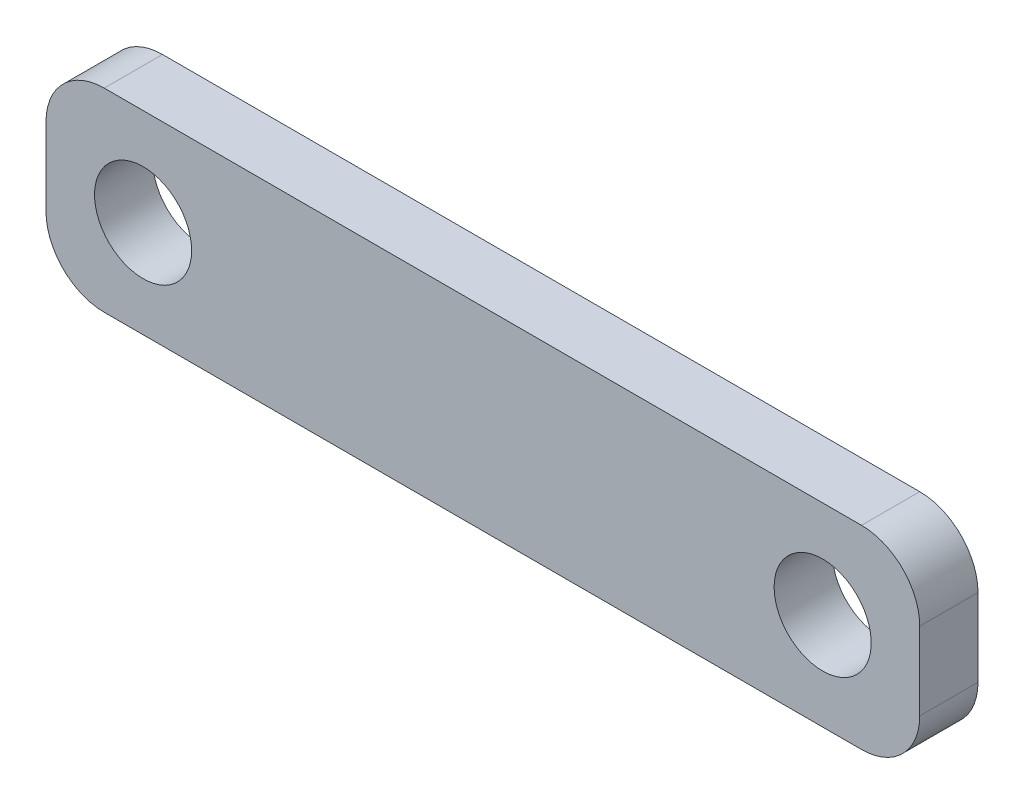
ISO-10303-21;
HEADER;
FILE_DESCRIPTION(('STEP AP214'),'2;1');
FILE_NAME('part.step','',(''),(''),'','','');
FILE_SCHEMA(('AUTOMOTIVE_DESIGN { 1 0 10303 214 1 1 1 1 }'));
ENDSEC;
DATA;
#1=APPLICATION_CONTEXT('core data for automotive mechanical design processes');
#2=APPLICATION_PROTOCOL_DEFINITION('international standard','automotive_design',2000,#1);
#3=PRODUCT_CONTEXT('',#1,'mechanical');
#4=PRODUCT('Part','Part','',(#3));
#5=PRODUCT_RELATED_PRODUCT_CATEGORY('part','',(#4));
#6=PRODUCT_DEFINITION_FORMATION('','',#4);
#7=PRODUCT_DEFINITION_CONTEXT('part definition',#1,'design');
#8=PRODUCT_DEFINITION('design','',#6,#7);
#9=PRODUCT_DEFINITION_SHAPE('','',#8);
#10=(LENGTH_UNIT() NAMED_UNIT(*) SI_UNIT(.MILLI.,.METRE.));
#11=(NAMED_UNIT(*) PLANE_ANGLE_UNIT() SI_UNIT($,.RADIAN.));
#12=(NAMED_UNIT(*) SI_UNIT($,.STERADIAN.) SOLID_ANGLE_UNIT());
#13=UNCERTAINTY_MEASURE_WITH_UNIT(LENGTH_MEASURE(1.E-05),#10,'distance_accuracy_value','');
#14=(GEOMETRIC_REPRESENTATION_CONTEXT(3) GLOBAL_UNCERTAINTY_ASSIGNED_CONTEXT((#13)) GLOBAL_UNIT_ASSIGNED_CONTEXT((#10,
#11,#12)) REPRESENTATION_CONTEXT('',''));
#15=CARTESIAN_POINT('',(0.,0.,0.));
#16=DIRECTION('',(0.,0.,1.));
#17=DIRECTION('',(1.,0.,0.));
#18=AXIS2_PLACEMENT_3D('',#15,#16,#17);
#19=CARTESIAN_POINT('',(19.5,-2.,3.));
#20=DIRECTION('',(0.,0.,1.));
#21=DIRECTION('',(1.,0.,0.));
#22=AXIS2_PLACEMENT_3D('',#19,#20,#21);
#23=PLANE('',#22);
#24=CARTESIAN_POINT('',(-17.5,0.,3.));
#25=DIRECTION('',(0.,0.,1.));
#26=DIRECTION('',(1.,0.,0.));
#27=AXIS2_PLACEMENT_3D('',#24,#25,#26);
#28=CIRCLE('',#27,2.5);
#29=CARTESIAN_POINT('',(-15.,0.,3.));
#30=VERTEX_POINT('',#29);
#31=EDGE_CURVE('E140',#30,#30,#28,.T.);
#32=ORIENTED_EDGE('',*,*,#31,.F.);
#33=EDGE_LOOP('',(#32));
#34=FACE_BOUND('',#33,.T.);
#35=CARTESIAN_POINT('',(19.5,-2.,3.));
#36=DIRECTION('',(0.,0.,1.));
#37=DIRECTION('',(1.,0.,0.));
#38=AXIS2_PLACEMENT_3D('',#35,#36,#37);
#39=CIRCLE('',#38,3.);
#40=CARTESIAN_POINT('',(19.5,-5.,3.));
#41=VERTEX_POINT('',#40);
#42=CARTESIAN_POINT('',(22.5,-1.99999999999998,3.));
#43=VERTEX_POINT('',#42);
#44=EDGE_CURVE('E151',#41,#43,#39,.T.);
#45=ORIENTED_EDGE('',*,*,#44,.T.);
#46=DIRECTION('',(0.,1.,0.));
#47=VECTOR('',#46,1.);
#48=CARTESIAN_POINT('',(22.5,-1.99999999999998,3.));
#49=LINE('',#48,#47);
#50=CARTESIAN_POINT('',(22.5,1.99999999999998,3.));
#51=VERTEX_POINT('',#50);
#52=EDGE_CURVE('E99',#43,#51,#49,.T.);
#53=ORIENTED_EDGE('',*,*,#52,.T.);
#54=CARTESIAN_POINT('',(19.5,2.,3.));
#55=DIRECTION('',(0.,0.,1.));
#56=DIRECTION('',(-1.,0.,0.));
#57=AXIS2_PLACEMENT_3D('',#54,#55,#56);
#58=CIRCLE('',#57,3.);
#59=CARTESIAN_POINT('',(19.5,5.,3.));
#60=VERTEX_POINT('',#59);
#61=EDGE_CURVE('E166',#51,#60,#58,.T.);
#62=ORIENTED_EDGE('',*,*,#61,.T.);
#63=DIRECTION('',(-1.,0.,0.));
#64=VECTOR('',#63,1.);
#65=CARTESIAN_POINT('',(-19.5,5.,3.));
#66=LINE('',#65,#64);
#67=CARTESIAN_POINT('',(-19.5,5.,3.));
#68=VERTEX_POINT('',#67);
#69=EDGE_CURVE('E179',#60,#68,#66,.T.);
#70=ORIENTED_EDGE('',*,*,#69,.T.);
#71=CARTESIAN_POINT('',(-19.5,2.,3.));
#72=DIRECTION('',(0.,0.,1.));
#73=DIRECTION('',(-1.,0.,0.));
#74=AXIS2_PLACEMENT_3D('',#71,#72,#73);
#75=CIRCLE('',#74,3.);
#76=CARTESIAN_POINT('',(-22.5,1.99999999999998,3.));
#77=VERTEX_POINT('',#76);
#78=EDGE_CURVE('E118',#68,#77,#75,.T.);
#79=ORIENTED_EDGE('',*,*,#78,.T.);
#80=DIRECTION('',(0.,-1.,0.));
#81=VECTOR('',#80,1.);
#82=CARTESIAN_POINT('',(-22.5,-1.99999999999998,3.));
#83=LINE('',#82,#81);
#84=CARTESIAN_POINT('',(-22.5,-2.,3.));
#85=VERTEX_POINT('',#84);
#86=EDGE_CURVE('E112',#77,#85,#83,.T.);
#87=ORIENTED_EDGE('',*,*,#86,.T.);
#88=CARTESIAN_POINT('',(-19.5,-2.,3.));
#89=DIRECTION('',(0.,0.,1.));
#90=DIRECTION('',(-1.,0.,0.));
#91=AXIS2_PLACEMENT_3D('',#88,#89,#90);
#92=CIRCLE('',#91,3.);
#93=CARTESIAN_POINT('',(-19.5,-5.,3.));
#94=VERTEX_POINT('',#93);
#95=EDGE_CURVE('E116',#85,#94,#92,.T.);
#96=ORIENTED_EDGE('',*,*,#95,.T.);
#97=DIRECTION('',(1.,0.,0.));
#98=VECTOR('',#97,1.);
#99=CARTESIAN_POINT('',(-19.5,-5.,3.));
#100=LINE('',#99,#98);
#101=EDGE_CURVE('E56',#94,#41,#100,.T.);
#102=ORIENTED_EDGE('',*,*,#101,.T.);
#103=EDGE_LOOP('',(#45,#53,#62,#70,#79,#87,#96,#102));
#104=FACE_BOUND('',#103,.T.);
#105=CARTESIAN_POINT('',(17.5,0.,3.));
#106=DIRECTION('',(0.,0.,1.));
#107=DIRECTION('',(-1.,0.,0.));
#108=AXIS2_PLACEMENT_3D('',#105,#106,#107);
#109=CIRCLE('',#108,2.5);
#110=CARTESIAN_POINT('',(15.,0.,3.));
#111=VERTEX_POINT('',#110);
#112=EDGE_CURVE('E188',#111,#111,#109,.T.);
#113=ORIENTED_EDGE('',*,*,#112,.F.);
#114=EDGE_LOOP('',(#113));
#115=FACE_BOUND('',#114,.T.);
#116=ADVANCED_FACE('F39',(#34,#104,#115),#23,.T.);
#117=CARTESIAN_POINT('',(19.5,-2.,0.));
#118=DIRECTION('',(0.,0.,1.));
#119=DIRECTION('',(1.,0.,0.));
#120=AXIS2_PLACEMENT_3D('',#117,#118,#119);
#121=PLANE('',#120);
#122=CARTESIAN_POINT('',(19.5,-2.,0.));
#123=DIRECTION('',(0.,0.,1.));
#124=DIRECTION('',(1.,0.,0.));
#125=AXIS2_PLACEMENT_3D('',#122,#123,#124);
#126=CIRCLE('',#125,3.);
#127=CARTESIAN_POINT('',(19.5,-5.,0.));
#128=VERTEX_POINT('',#127);
#129=CARTESIAN_POINT('',(22.5,-1.99999999999998,0.));
#130=VERTEX_POINT('',#129);
#131=EDGE_CURVE('E136',#128,#130,#126,.T.);
#132=ORIENTED_EDGE('',*,*,#131,.F.);
#133=DIRECTION('',(1.,0.,0.));
#134=VECTOR('',#133,1.);
#135=CARTESIAN_POINT('',(-19.5,-5.,0.));
#136=LINE('',#135,#134);
#137=CARTESIAN_POINT('',(-19.5,-5.,0.));
#138=VERTEX_POINT('',#137);
#139=EDGE_CURVE('E91',#138,#128,#136,.T.);
#140=ORIENTED_EDGE('',*,*,#139,.F.);
#141=CARTESIAN_POINT('',(-19.5,-2.,0.));
#142=DIRECTION('',(0.,0.,1.));
#143=DIRECTION('',(-1.,0.,0.));
#144=AXIS2_PLACEMENT_3D('',#141,#142,#143);
#145=CIRCLE('',#144,3.);
#146=CARTESIAN_POINT('',(-22.5,-2.,0.));
#147=VERTEX_POINT('',#146);
#148=EDGE_CURVE('E85',#147,#138,#145,.T.);
#149=ORIENTED_EDGE('',*,*,#148,.F.);
#150=DIRECTION('',(0.,-1.,0.));
#151=VECTOR('',#150,1.);
#152=CARTESIAN_POINT('',(-22.5,-1.99999999999998,0.));
#153=LINE('',#152,#151);
#154=CARTESIAN_POINT('',(-22.5,1.99999999999998,0.));
#155=VERTEX_POINT('',#154);
#156=EDGE_CURVE('E126',#155,#147,#153,.T.);
#157=ORIENTED_EDGE('',*,*,#156,.F.);
#158=CARTESIAN_POINT('',(-19.5,2.,0.));
#159=DIRECTION('',(0.,0.,1.));
#160=DIRECTION('',(-1.,0.,0.));
#161=AXIS2_PLACEMENT_3D('',#158,#159,#160);
#162=CIRCLE('',#161,3.);
#163=CARTESIAN_POINT('',(-19.5,5.,0.));
#164=VERTEX_POINT('',#163);
#165=EDGE_CURVE('E146',#164,#155,#162,.T.);
#166=ORIENTED_EDGE('',*,*,#165,.F.);
#167=DIRECTION('',(-1.,0.,0.));
#168=VECTOR('',#167,1.);
#169=CARTESIAN_POINT('',(-19.5,5.,0.));
#170=LINE('',#169,#168);
#171=CARTESIAN_POINT('',(19.5,5.,0.));
#172=VERTEX_POINT('',#171);
#173=EDGE_CURVE('E144',#172,#164,#170,.T.);
#174=ORIENTED_EDGE('',*,*,#173,.F.);
#175=CARTESIAN_POINT('',(19.5,2.,0.));
#176=DIRECTION('',(0.,0.,1.));
#177=DIRECTION('',(-1.,0.,0.));
#178=AXIS2_PLACEMENT_3D('',#175,#176,#177);
#179=CIRCLE('',#178,3.);
#180=CARTESIAN_POINT('',(22.5,1.99999999999998,0.));
#181=VERTEX_POINT('',#180);
#182=EDGE_CURVE('E142',#181,#172,#179,.T.);
#183=ORIENTED_EDGE('',*,*,#182,.F.);
#184=DIRECTION('',(0.,1.,0.));
#185=VECTOR('',#184,1.);
#186=CARTESIAN_POINT('',(22.5,-1.99999999999998,0.));
#187=LINE('',#186,#185);
#188=EDGE_CURVE('E139',#130,#181,#187,.T.);
#189=ORIENTED_EDGE('',*,*,#188,.F.);
#190=EDGE_LOOP('',(#132,#140,#149,#157,#166,#174,#183,#189));
#191=FACE_BOUND('',#190,.T.);
#192=CARTESIAN_POINT('',(-17.5,0.,0.));
#193=DIRECTION('',(0.,0.,1.));
#194=DIRECTION('',(1.,0.,0.));
#195=AXIS2_PLACEMENT_3D('',#192,#193,#194);
#196=CIRCLE('',#195,2.5);
#197=CARTESIAN_POINT('',(-15.,0.,0.));
#198=VERTEX_POINT('',#197);
#199=EDGE_CURVE('E185',#198,#198,#196,.T.);
#200=ORIENTED_EDGE('',*,*,#199,.T.);
#201=EDGE_LOOP('',(#200));
#202=FACE_BOUND('',#201,.T.);
#203=CARTESIAN_POINT('',(17.5,0.,0.));
#204=DIRECTION('',(0.,0.,1.));
#205=DIRECTION('',(-1.,0.,0.));
#206=AXIS2_PLACEMENT_3D('',#203,#204,#205);
#207=CIRCLE('',#206,2.5);
#208=CARTESIAN_POINT('',(15.,0.,0.));
#209=VERTEX_POINT('',#208);
#210=EDGE_CURVE('E191',#209,#209,#207,.T.);
#211=ORIENTED_EDGE('',*,*,#210,.T.);
#212=EDGE_LOOP('',(#211));
#213=FACE_BOUND('',#212,.T.);
#214=ADVANCED_FACE('F170',(#191,#202,#213),#121,.F.);
#215=CARTESIAN_POINT('',(19.5,-2.,3.));
#216=DIRECTION('',(0.,0.,-1.));
#217=DIRECTION('',(-1.,0.,0.));
#218=AXIS2_PLACEMENT_3D('',#215,#216,#217);
#219=CYLINDRICAL_SURFACE('',#218,3.);
#220=ORIENTED_EDGE('',*,*,#131,.T.);
#221=DIRECTION('',(0.,0.,-1.));
#222=VECTOR('',#221,1.);
#223=CARTESIAN_POINT('',(22.5,-1.99999999999998,3.));
#224=LINE('',#223,#222);
#225=EDGE_CURVE('E11',#43,#130,#224,.T.);
#226=ORIENTED_EDGE('',*,*,#225,.F.);
#227=ORIENTED_EDGE('',*,*,#44,.F.);
#228=DIRECTION('',(0.,0.,-1.));
#229=VECTOR('',#228,1.);
#230=CARTESIAN_POINT('',(19.5,-5.,3.));
#231=LINE('',#230,#229);
#232=EDGE_CURVE('E132',#41,#128,#231,.T.);
#233=ORIENTED_EDGE('',*,*,#232,.T.);
#234=EDGE_LOOP('',(#220,#226,#227,#233));
#235=FACE_BOUND('',#234,.T.);
#236=ADVANCED_FACE('F41',(#235),#219,.T.);
#237=CARTESIAN_POINT('',(22.5,-1.99999999999998,3.));
#238=DIRECTION('',(-1.,0.,0.));
#239=DIRECTION('',(0.,0.,1.));
#240=AXIS2_PLACEMENT_3D('',#237,#238,#239);
#241=PLANE('',#240);
#242=ORIENTED_EDGE('',*,*,#188,.T.);
#243=DIRECTION('',(0.,0.,-1.));
#244=VECTOR('',#243,1.);
#245=CARTESIAN_POINT('',(22.5,1.99999999999998,3.));
#246=LINE('',#245,#244);
#247=EDGE_CURVE('E48',#51,#181,#246,.T.);
#248=ORIENTED_EDGE('',*,*,#247,.F.);
#249=ORIENTED_EDGE('',*,*,#52,.F.);
#250=ORIENTED_EDGE('',*,*,#225,.T.);
#251=EDGE_LOOP('',(#242,#248,#249,#250));
#252=FACE_BOUND('',#251,.T.);
#253=ADVANCED_FACE('F223',(#252),#241,.F.);
#254=CARTESIAN_POINT('',(19.5,2.,3.));
#255=DIRECTION('',(0.,0.,-1.));
#256=DIRECTION('',(-1.,0.,0.));
#257=AXIS2_PLACEMENT_3D('',#254,#255,#256);
#258=CYLINDRICAL_SURFACE('',#257,3.);
#259=ORIENTED_EDGE('',*,*,#182,.T.);
#260=DIRECTION('',(0.,0.,-1.));
#261=VECTOR('',#260,1.);
#262=CARTESIAN_POINT('',(19.5,5.,3.));
#263=LINE('',#262,#261);
#264=EDGE_CURVE('E158',#60,#172,#263,.T.);
#265=ORIENTED_EDGE('',*,*,#264,.F.);
#266=ORIENTED_EDGE('',*,*,#61,.F.);
#267=ORIENTED_EDGE('',*,*,#247,.T.);
#268=EDGE_LOOP('',(#259,#265,#266,#267));
#269=FACE_BOUND('',#268,.T.);
#270=ADVANCED_FACE('F164',(#269),#258,.T.);
#271=CARTESIAN_POINT('',(-19.5,5.,3.));
#272=DIRECTION('',(0.,-1.,0.));
#273=DIRECTION('',(0.,0.,-1.));
#274=AXIS2_PLACEMENT_3D('',#271,#272,#273);
#275=PLANE('',#274);
#276=ORIENTED_EDGE('',*,*,#173,.T.);
#277=DIRECTION('',(0.,0.,-1.));
#278=VECTOR('',#277,1.);
#279=CARTESIAN_POINT('',(-19.5,5.,3.));
#280=LINE('',#279,#278);
#281=EDGE_CURVE('E155',#68,#164,#280,.T.);
#282=ORIENTED_EDGE('',*,*,#281,.F.);
#283=ORIENTED_EDGE('',*,*,#69,.F.);
#284=ORIENTED_EDGE('',*,*,#264,.T.);
#285=EDGE_LOOP('',(#276,#282,#283,#284));
#286=FACE_BOUND('',#285,.T.);
#287=ADVANCED_FACE('F175',(#286),#275,.F.);
#288=CARTESIAN_POINT('',(-19.5,2.,3.));
#289=DIRECTION('',(0.,0.,-1.));
#290=DIRECTION('',(-1.,0.,0.));
#291=AXIS2_PLACEMENT_3D('',#288,#289,#290);
#292=CYLINDRICAL_SURFACE('',#291,3.);
#293=ORIENTED_EDGE('',*,*,#165,.T.);
#294=DIRECTION('',(0.,0.,-1.));
#295=VECTOR('',#294,1.);
#296=CARTESIAN_POINT('',(-22.5,1.99999999999998,3.));
#297=LINE('',#296,#295);
#298=EDGE_CURVE('E127',#77,#155,#297,.T.);
#299=ORIENTED_EDGE('',*,*,#298,.F.);
#300=ORIENTED_EDGE('',*,*,#78,.F.);
#301=ORIENTED_EDGE('',*,*,#281,.T.);
#302=EDGE_LOOP('',(#293,#299,#300,#301));
#303=FACE_BOUND('',#302,.T.);
#304=ADVANCED_FACE('F178',(#303),#292,.T.);
#305=CARTESIAN_POINT('',(-22.5,-1.99999999999998,3.));
#306=DIRECTION('',(1.,0.,0.));
#307=DIRECTION('',(0.,0.,-1.));
#308=AXIS2_PLACEMENT_3D('',#305,#306,#307);
#309=PLANE('',#308);
#310=ORIENTED_EDGE('',*,*,#156,.T.);
#311=DIRECTION('',(0.,0.,-1.));
#312=VECTOR('',#311,1.);
#313=CARTESIAN_POINT('',(-22.5,-2.,3.));
#314=LINE('',#313,#312);
#315=EDGE_CURVE('E123',#85,#147,#314,.T.);
#316=ORIENTED_EDGE('',*,*,#315,.F.);
#317=ORIENTED_EDGE('',*,*,#86,.F.);
#318=ORIENTED_EDGE('',*,*,#298,.T.);
#319=EDGE_LOOP('',(#310,#316,#317,#318));
#320=FACE_BOUND('',#319,.T.);
#321=ADVANCED_FACE('F124',(#320),#309,.F.);
#322=CARTESIAN_POINT('',(-19.5,-2.,3.));
#323=DIRECTION('',(0.,0.,-1.));
#324=DIRECTION('',(-1.,0.,0.));
#325=AXIS2_PLACEMENT_3D('',#322,#323,#324);
#326=CYLINDRICAL_SURFACE('',#325,3.);
#327=ORIENTED_EDGE('',*,*,#148,.T.);
#328=DIRECTION('',(0.,0.,-1.));
#329=VECTOR('',#328,1.);
#330=CARTESIAN_POINT('',(-19.5,-5.,3.));
#331=LINE('',#330,#329);
#332=EDGE_CURVE('E128',#94,#138,#331,.T.);
#333=ORIENTED_EDGE('',*,*,#332,.F.);
#334=ORIENTED_EDGE('',*,*,#95,.F.);
#335=ORIENTED_EDGE('',*,*,#315,.T.);
#336=EDGE_LOOP('',(#327,#333,#334,#335));
#337=FACE_BOUND('',#336,.T.);
#338=ADVANCED_FACE('F130',(#337),#326,.T.);
#339=CARTESIAN_POINT('',(-19.5,-5.,3.));
#340=DIRECTION('',(0.,1.,0.));
#341=DIRECTION('',(0.,0.,1.));
#342=AXIS2_PLACEMENT_3D('',#339,#340,#341);
#343=PLANE('',#342);
#344=ORIENTED_EDGE('',*,*,#139,.T.);
#345=ORIENTED_EDGE('',*,*,#232,.F.);
#346=ORIENTED_EDGE('',*,*,#101,.F.);
#347=ORIENTED_EDGE('',*,*,#332,.T.);
#348=EDGE_LOOP('',(#344,#345,#346,#347));
#349=FACE_BOUND('',#348,.T.);
#350=ADVANCED_FACE('F211',(#349),#343,.F.);
#351=CARTESIAN_POINT('',(-17.5,0.,3.));
#352=DIRECTION('',(0.,0.,-1.));
#353=DIRECTION('',(-1.,0.,0.));
#354=AXIS2_PLACEMENT_3D('',#351,#352,#353);
#355=CYLINDRICAL_SURFACE('',#354,2.5);
#356=ORIENTED_EDGE('',*,*,#31,.T.);
#357=EDGE_LOOP('',(#356));
#358=FACE_BOUND('',#357,.T.);
#359=ORIENTED_EDGE('',*,*,#199,.F.);
#360=EDGE_LOOP('',(#359));
#361=FACE_BOUND('',#360,.T.);
#362=ADVANCED_FACE('F208',(#358,#361),#355,.F.);
#363=CARTESIAN_POINT('',(17.5,0.,3.));
#364=DIRECTION('',(0.,0.,-1.));
#365=DIRECTION('',(-1.,0.,0.));
#366=AXIS2_PLACEMENT_3D('',#363,#364,#365);
#367=CYLINDRICAL_SURFACE('',#366,2.5);
#368=ORIENTED_EDGE('',*,*,#112,.T.);
#369=EDGE_LOOP('',(#368));
#370=FACE_BOUND('',#369,.T.);
#371=ORIENTED_EDGE('',*,*,#210,.F.);
#372=EDGE_LOOP('',(#371));
#373=FACE_BOUND('',#372,.T.);
#374=ADVANCED_FACE('F197',(#370,#373),#367,.F.);
#375=CLOSED_SHELL('',(#116,#214,#236,#253,#270,#287,#304,#321,#338,#350,#362,#374));
#376=MANIFOLD_SOLID_BREP('B2',#375);
#377=ADVANCED_BREP_SHAPE_REPRESENTATION('',(#18,#376),#14);
#378=SHAPE_DEFINITION_REPRESENTATION(#9,#377);
ENDSEC;
END-ISO-10303-21;
